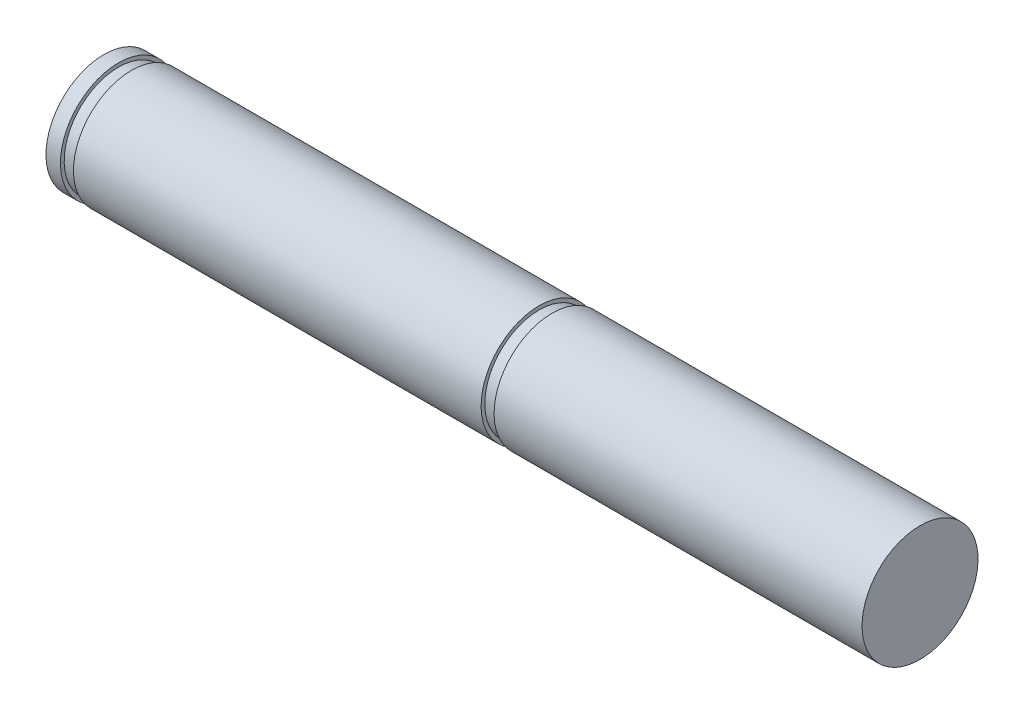
ISO-10303-21;
HEADER;
FILE_DESCRIPTION(('STEP AP214'),'2;1');
FILE_NAME('part.step','',(''),(''),'','','');
FILE_SCHEMA(('AUTOMOTIVE_DESIGN { 1 0 10303 214 1 1 1 1 }'));
ENDSEC;
DATA;
#1=APPLICATION_CONTEXT('core data for automotive mechanical design processes');
#2=APPLICATION_PROTOCOL_DEFINITION('international standard','automotive_design',2000,#1);
#3=PRODUCT_CONTEXT('',#1,'mechanical');
#4=PRODUCT('Part','Part','',(#3));
#5=PRODUCT_RELATED_PRODUCT_CATEGORY('part','',(#4));
#6=PRODUCT_DEFINITION_FORMATION('','',#4);
#7=PRODUCT_DEFINITION_CONTEXT('part definition',#1,'design');
#8=PRODUCT_DEFINITION('design','',#6,#7);
#9=PRODUCT_DEFINITION_SHAPE('','',#8);
#10=(LENGTH_UNIT() NAMED_UNIT(*) SI_UNIT(.MILLI.,.METRE.));
#11=(NAMED_UNIT(*) PLANE_ANGLE_UNIT() SI_UNIT($,.RADIAN.));
#12=(NAMED_UNIT(*) SI_UNIT($,.STERADIAN.) SOLID_ANGLE_UNIT());
#13=UNCERTAINTY_MEASURE_WITH_UNIT(LENGTH_MEASURE(1.E-05),#10,'distance_accuracy_value','');
#14=(GEOMETRIC_REPRESENTATION_CONTEXT(3) GLOBAL_UNCERTAINTY_ASSIGNED_CONTEXT((#13)) GLOBAL_UNIT_ASSIGNED_CONTEXT((#10,
#11,#12)) REPRESENTATION_CONTEXT('',''));
#15=CARTESIAN_POINT('',(0.,0.,0.));
#16=DIRECTION('',(0.,0.,1.));
#17=DIRECTION('',(1.,0.,0.));
#18=AXIS2_PLACEMENT_3D('',#15,#16,#17);
#19=CARTESIAN_POINT('',(0.,0.,0.));
#20=DIRECTION('',(-1.,0.,0.));
#21=DIRECTION('',(0.,-1.,0.));
#22=AXIS2_PLACEMENT_3D('',#19,#20,#21);
#23=PLANE('',#22);
#24=CARTESIAN_POINT('',(0.,0.,0.));
#25=DIRECTION('',(1.,0.,0.));
#26=DIRECTION('',(0.,1.,0.));
#27=AXIS2_PLACEMENT_3D('',#24,#25,#26);
#28=CIRCLE('',#27,6.35);
#29=CARTESIAN_POINT('',(0.,6.35,0.));
#30=VERTEX_POINT('',#29);
#31=EDGE_CURVE('E10',#30,#30,#28,.T.);
#32=ORIENTED_EDGE('',*,*,#31,.F.);
#33=EDGE_LOOP('',(#32));
#34=FACE_BOUND('',#33,.T.);
#35=ADVANCED_FACE('F33',(#34),#23,.T.);
#36=CARTESIAN_POINT('',(0.,0.,0.));
#37=DIRECTION('',(1.,0.,0.));
#38=DIRECTION('',(0.,1.,0.));
#39=AXIS2_PLACEMENT_3D('',#36,#37,#38);
#40=CYLINDRICAL_SURFACE('',#39,6.35);
#41=ORIENTED_EDGE('',*,*,#31,.T.);
#42=EDGE_LOOP('',(#41));
#43=FACE_BOUND('',#42,.T.);
#44=CARTESIAN_POINT('',(1.58750000000001,0.,0.));
#45=DIRECTION('',(1.,0.,0.));
#46=DIRECTION('',(0.,1.,0.));
#47=AXIS2_PLACEMENT_3D('',#44,#45,#46);
#48=CIRCLE('',#47,6.35);
#49=CARTESIAN_POINT('',(1.5875,6.35,0.));
#50=VERTEX_POINT('',#49);
#51=EDGE_CURVE('E39',#50,#50,#48,.T.);
#52=ORIENTED_EDGE('',*,*,#51,.F.);
#53=EDGE_LOOP('',(#52));
#54=FACE_BOUND('',#53,.T.);
#55=ADVANCED_FACE('F87',(#43,#54),#40,.T.);
#56=CARTESIAN_POINT('',(1.5875,6.35,0.));
#57=DIRECTION('',(1.,0.,0.));
#58=DIRECTION('',(0.,1.,0.));
#59=AXIS2_PLACEMENT_3D('',#56,#57,#58);
#60=PLANE('',#59);
#61=ORIENTED_EDGE('',*,*,#51,.T.);
#62=EDGE_LOOP('',(#61));
#63=FACE_BOUND('',#62,.T.);
#64=CARTESIAN_POINT('',(1.5875,0.,0.));
#65=DIRECTION('',(1.,0.,0.));
#66=DIRECTION('',(0.,1.,0.));
#67=AXIS2_PLACEMENT_3D('',#64,#65,#66);
#68=CIRCLE('',#67,5.94359999999999);
#69=CARTESIAN_POINT('',(1.5875,5.94359999999999,0.));
#70=VERTEX_POINT('',#69);
#71=EDGE_CURVE('E43',#70,#70,#68,.T.);
#72=ORIENTED_EDGE('',*,*,#71,.F.);
#73=EDGE_LOOP('',(#72));
#74=FACE_BOUND('',#73,.T.);
#75=ADVANCED_FACE('F92',(#63,#74),#60,.T.);
#76=CARTESIAN_POINT('',(0.,0.,0.));
#77=DIRECTION('',(1.,0.,0.));
#78=DIRECTION('',(0.,1.,0.));
#79=AXIS2_PLACEMENT_3D('',#76,#77,#78);
#80=CYLINDRICAL_SURFACE('',#79,5.94359999999999);
#81=ORIENTED_EDGE('',*,*,#71,.T.);
#82=EDGE_LOOP('',(#81));
#83=FACE_BOUND('',#82,.T.);
#84=CARTESIAN_POINT('',(3.0099,0.,0.));
#85=DIRECTION('',(1.,0.,0.));
#86=DIRECTION('',(0.,1.,0.));
#87=AXIS2_PLACEMENT_3D('',#84,#85,#86);
#88=CIRCLE('',#87,5.94359999999999);
#89=CARTESIAN_POINT('',(3.0099,5.94359999999999,0.));
#90=VERTEX_POINT('',#89);
#91=EDGE_CURVE('E47',#90,#90,#88,.T.);
#92=ORIENTED_EDGE('',*,*,#91,.F.);
#93=EDGE_LOOP('',(#92));
#94=FACE_BOUND('',#93,.T.);
#95=ADVANCED_FACE('F96',(#83,#94),#80,.T.);
#96=CARTESIAN_POINT('',(3.0099,5.94359999999999,0.));
#97=DIRECTION('',(-1.,0.,0.));
#98=DIRECTION('',(0.,-1.,0.));
#99=AXIS2_PLACEMENT_3D('',#96,#97,#98);
#100=PLANE('',#99);
#101=ORIENTED_EDGE('',*,*,#91,.T.);
#102=EDGE_LOOP('',(#101));
#103=FACE_BOUND('',#102,.T.);
#104=CARTESIAN_POINT('',(3.00990000000001,0.,0.));
#105=DIRECTION('',(1.,0.,0.));
#106=DIRECTION('',(0.,1.,0.));
#107=AXIS2_PLACEMENT_3D('',#104,#105,#106);
#108=CIRCLE('',#107,6.34999999999999);
#109=CARTESIAN_POINT('',(3.0099,6.34999999999999,0.));
#110=VERTEX_POINT('',#109);
#111=EDGE_CURVE('E52',#110,#110,#108,.T.);
#112=ORIENTED_EDGE('',*,*,#111,.F.);
#113=EDGE_LOOP('',(#112));
#114=FACE_BOUND('',#113,.T.);
#115=ADVANCED_FACE('F102',(#103,#114),#100,.T.);
#116=CARTESIAN_POINT('',(0.,0.,0.));
#117=DIRECTION('',(1.,0.,0.));
#118=DIRECTION('',(0.,1.,0.));
#119=AXIS2_PLACEMENT_3D('',#116,#117,#118);
#120=CYLINDRICAL_SURFACE('',#119,6.34999999999997);
#121=ORIENTED_EDGE('',*,*,#111,.T.);
#122=EDGE_LOOP('',(#121));
#123=FACE_BOUND('',#122,.T.);
#124=CARTESIAN_POINT('',(47.6504,0.,0.));
#125=DIRECTION('',(1.,0.,0.));
#126=DIRECTION('',(0.,1.,0.));
#127=AXIS2_PLACEMENT_3D('',#124,#125,#126);
#128=CIRCLE('',#127,6.34999999999996);
#129=CARTESIAN_POINT('',(47.6504,6.35,0.));
#130=VERTEX_POINT('',#129);
#131=EDGE_CURVE('E55',#130,#130,#128,.T.);
#132=ORIENTED_EDGE('',*,*,#131,.F.);
#133=EDGE_LOOP('',(#132));
#134=FACE_BOUND('',#133,.T.);
#135=ADVANCED_FACE('F106',(#123,#134),#120,.T.);
#136=CARTESIAN_POINT('',(47.6504,6.35,0.));
#137=DIRECTION('',(1.,0.,0.));
#138=DIRECTION('',(0.,1.,0.));
#139=AXIS2_PLACEMENT_3D('',#136,#137,#138);
#140=PLANE('',#139);
#141=ORIENTED_EDGE('',*,*,#131,.T.);
#142=EDGE_LOOP('',(#141));
#143=FACE_BOUND('',#142,.T.);
#144=CARTESIAN_POINT('',(47.6504,0.,0.));
#145=DIRECTION('',(1.,0.,0.));
#146=DIRECTION('',(0.,1.,0.));
#147=AXIS2_PLACEMENT_3D('',#144,#145,#146);
#148=CIRCLE('',#147,5.94359999999997);
#149=CARTESIAN_POINT('',(47.6504,5.94360000000001,0.));
#150=VERTEX_POINT('',#149);
#151=EDGE_CURVE('E58',#150,#150,#148,.T.);
#152=ORIENTED_EDGE('',*,*,#151,.F.);
#153=EDGE_LOOP('',(#152));
#154=FACE_BOUND('',#153,.T.);
#155=ADVANCED_FACE('F110',(#143,#154),#140,.T.);
#156=CARTESIAN_POINT('',(0.,0.,0.));
#157=DIRECTION('',(1.,0.,0.));
#158=DIRECTION('',(0.,1.,0.));
#159=AXIS2_PLACEMENT_3D('',#156,#157,#158);
#160=CYLINDRICAL_SURFACE('',#159,5.94359999999997);
#161=ORIENTED_EDGE('',*,*,#151,.T.);
#162=EDGE_LOOP('',(#161));
#163=FACE_BOUND('',#162,.T.);
#164=CARTESIAN_POINT('',(49.0728,0.,0.));
#165=DIRECTION('',(1.,0.,0.));
#166=DIRECTION('',(0.,1.,0.));
#167=AXIS2_PLACEMENT_3D('',#164,#165,#166);
#168=CIRCLE('',#167,5.94359999999997);
#169=CARTESIAN_POINT('',(49.0728,5.94360000000001,0.));
#170=VERTEX_POINT('',#169);
#171=EDGE_CURVE('E61',#170,#170,#168,.T.);
#172=ORIENTED_EDGE('',*,*,#171,.F.);
#173=EDGE_LOOP('',(#172));
#174=FACE_BOUND('',#173,.T.);
#175=ADVANCED_FACE('F83',(#163,#174),#160,.T.);
#176=CARTESIAN_POINT('',(49.0728,5.94360000000001,0.));
#177=DIRECTION('',(-1.,0.,0.));
#178=DIRECTION('',(0.,-1.,0.));
#179=AXIS2_PLACEMENT_3D('',#176,#177,#178);
#180=PLANE('',#179);
#181=ORIENTED_EDGE('',*,*,#171,.T.);
#182=EDGE_LOOP('',(#181));
#183=FACE_BOUND('',#182,.T.);
#184=CARTESIAN_POINT('',(49.0728,0.,0.));
#185=DIRECTION('',(1.,0.,0.));
#186=DIRECTION('',(0.,1.,0.));
#187=AXIS2_PLACEMENT_3D('',#184,#185,#186);
#188=CIRCLE('',#187,6.34999999999996);
#189=CARTESIAN_POINT('',(49.0728,6.35,0.));
#190=VERTEX_POINT('',#189);
#191=EDGE_CURVE('E64',#190,#190,#188,.T.);
#192=ORIENTED_EDGE('',*,*,#191,.F.);
#193=EDGE_LOOP('',(#192));
#194=FACE_BOUND('',#193,.T.);
#195=ADVANCED_FACE('F75',(#183,#194),#180,.T.);
#196=CARTESIAN_POINT('',(0.,0.,0.));
#197=DIRECTION('',(1.,0.,0.));
#198=DIRECTION('',(0.,1.,0.));
#199=AXIS2_PLACEMENT_3D('',#196,#197,#198);
#200=CYLINDRICAL_SURFACE('',#199,6.34999999999995);
#201=ORIENTED_EDGE('',*,*,#191,.T.);
#202=EDGE_LOOP('',(#201));
#203=FACE_BOUND('',#202,.T.);
#204=CARTESIAN_POINT('',(89.3699,0.,0.));
#205=DIRECTION('',(1.,0.,0.));
#206=DIRECTION('',(0.,1.,0.));
#207=AXIS2_PLACEMENT_3D('',#204,#205,#206);
#208=CIRCLE('',#207,6.34999999999994);
#209=CARTESIAN_POINT('',(89.3699,6.35000000000001,0.));
#210=VERTEX_POINT('',#209);
#211=EDGE_CURVE('E67',#210,#210,#208,.T.);
#212=ORIENTED_EDGE('',*,*,#211,.F.);
#213=EDGE_LOOP('',(#212));
#214=FACE_BOUND('',#213,.T.);
#215=ADVANCED_FACE('F73',(#203,#214),#200,.T.);
#216=CARTESIAN_POINT('',(89.3699,6.35000000000001,0.));
#217=DIRECTION('',(1.,0.,0.));
#218=DIRECTION('',(0.,1.,0.));
#219=AXIS2_PLACEMENT_3D('',#216,#217,#218);
#220=PLANE('',#219);
#221=ORIENTED_EDGE('',*,*,#211,.T.);
#222=EDGE_LOOP('',(#221));
#223=FACE_BOUND('',#222,.T.);
#224=ADVANCED_FACE('F71',(#223),#220,.T.);
#225=CLOSED_SHELL('',(#35,#55,#75,#95,#115,#135,#155,#175,#195,#215,#224));
#226=MANIFOLD_SOLID_BREP('B2',#225);
#227=ADVANCED_BREP_SHAPE_REPRESENTATION('',(#18,#226),#14);
#228=SHAPE_DEFINITION_REPRESENTATION(#9,#227);
ENDSEC;
END-ISO-10303-21;
